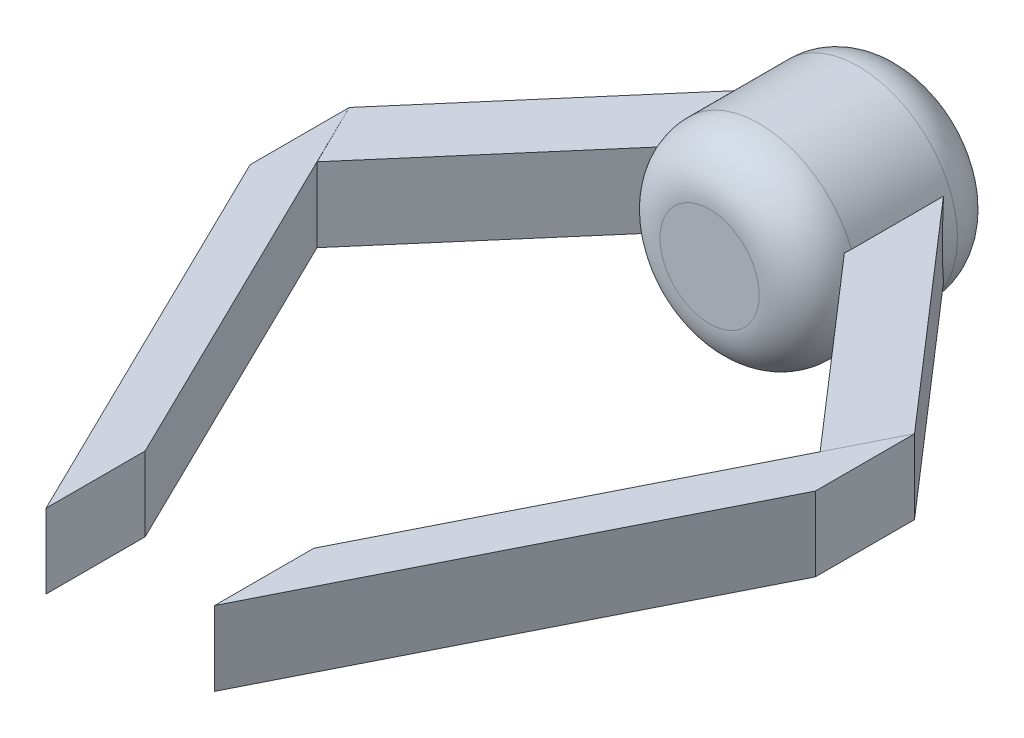
ISO-10303-21;
HEADER;
FILE_DESCRIPTION(('STEP AP214'),'2;1');
FILE_NAME('part.step','',(''),(''),'','','');
FILE_SCHEMA(('AUTOMOTIVE_DESIGN { 1 0 10303 214 1 1 1 1 }'));
ENDSEC;
DATA;
#1=APPLICATION_CONTEXT('core data for automotive mechanical design processes');
#2=APPLICATION_PROTOCOL_DEFINITION('international standard','automotive_design',2000,#1);
#3=PRODUCT_CONTEXT('',#1,'mechanical');
#4=PRODUCT('Part','Part','',(#3));
#5=PRODUCT_RELATED_PRODUCT_CATEGORY('part','',(#4));
#6=PRODUCT_DEFINITION_FORMATION('','',#4);
#7=PRODUCT_DEFINITION_CONTEXT('part definition',#1,'design');
#8=PRODUCT_DEFINITION('design','',#6,#7);
#9=PRODUCT_DEFINITION_SHAPE('','',#8);
#10=(LENGTH_UNIT() NAMED_UNIT(*) SI_UNIT(.MILLI.,.METRE.));
#11=(NAMED_UNIT(*) PLANE_ANGLE_UNIT() SI_UNIT($,.RADIAN.));
#12=(NAMED_UNIT(*) SI_UNIT($,.STERADIAN.) SOLID_ANGLE_UNIT());
#13=UNCERTAINTY_MEASURE_WITH_UNIT(LENGTH_MEASURE(1.E-05),#10,'distance_accuracy_value','');
#14=(GEOMETRIC_REPRESENTATION_CONTEXT(3) GLOBAL_UNCERTAINTY_ASSIGNED_CONTEXT((#13)) GLOBAL_UNIT_ASSIGNED_CONTEXT((#10,
#11,#12)) REPRESENTATION_CONTEXT('',''));
#15=CARTESIAN_POINT('',(0.,0.,0.));
#16=DIRECTION('',(0.,0.,1.));
#17=DIRECTION('',(1.,0.,0.));
#18=AXIS2_PLACEMENT_3D('',#15,#16,#17);
#19=CARTESIAN_POINT('',(0.,0.,40.));
#20=DIRECTION('',(0.,0.,-1.));
#21=DIRECTION('',(-1.,0.,0.));
#22=AXIS2_PLACEMENT_3D('',#19,#20,#21);
#23=CYLINDRICAL_SURFACE('',#22,20.);
#24=CARTESIAN_POINT('',(0.,0.,10.));
#25=DIRECTION('',(0.,0.,1.));
#26=DIRECTION('',(1.,0.,0.));
#27=AXIS2_PLACEMENT_3D('',#24,#25,#26);
#28=CIRCLE('',#27,20.);
#29=CARTESIAN_POINT('',(20.,0.,10.));
#30=VERTEX_POINT('',#29);
#31=EDGE_CURVE('E256',#30,#30,#28,.T.);
#32=ORIENTED_EDGE('',*,*,#31,.T.);
#33=EDGE_LOOP('',(#32));
#34=FACE_BOUND('',#33,.T.);
#35=DIRECTION('',(0.,0.,-1.));
#36=VECTOR('',#35,1.);
#37=CARTESIAN_POINT('',(-18.6133283799586,7.31737703141151,40.));
#38=LINE('',#37,#36);
#39=CARTESIAN_POINT('',(-18.6133283799586,7.31737703141151,11.440508091184));
#40=VERTEX_POINT('',#39);
#41=CARTESIAN_POINT('',(-18.6133283799586,7.31737703141151,30.));
#42=VERTEX_POINT('',#41);
#43=EDGE_CURVE('E484',#40,#42,#38,.F.);
#44=ORIENTED_EDGE('',*,*,#43,.T.);
#45=CARTESIAN_POINT('',(0.,0.,30.));
#46=DIRECTION('',(0.,0.,1.));
#47=DIRECTION('',(1.,0.,0.));
#48=AXIS2_PLACEMENT_3D('',#45,#46,#47);
#49=CIRCLE('',#48,20.);
#50=CARTESIAN_POINT('',(18.6133283799586,7.31737703141151,30.));
#51=VERTEX_POINT('',#50);
#52=EDGE_CURVE('E497',#42,#51,#49,.F.);
#53=ORIENTED_EDGE('',*,*,#52,.T.);
#54=DIRECTION('',(0.,0.,-1.));
#55=VECTOR('',#54,1.);
#56=CARTESIAN_POINT('',(18.6133283799586,7.31737703141151,40.));
#57=LINE('',#56,#55);
#58=CARTESIAN_POINT('',(18.6133283799586,7.31737703141151,11.440508091184));
#59=VERTEX_POINT('',#58);
#60=EDGE_CURVE('E455',#51,#59,#57,.T.);
#61=ORIENTED_EDGE('',*,*,#60,.T.);
#62=CARTESIAN_POINT('',(0.,0.,-10.0060589823485));
#63=DIRECTION('',(0.75523046556724,0.,-0.65545933808215));
#64=DIRECTION('',(-0.65545933808215,0.,-0.75523046556724));
#65=AXIS2_PLACEMENT_3D('',#62,#63,#64);
#66=ELLIPSE('',#65,30.5129530361399,20.);
#67=CARTESIAN_POINT('',(18.4658717578449,-7.68189951918308,11.2706062728718));
#68=VERTEX_POINT('',#67);
#69=EDGE_CURVE('E475',#59,#68,#66,.T.);
#70=ORIENTED_EDGE('',*,*,#69,.T.);
#71=DIRECTION('',(0.,0.,-1.));
#72=VECTOR('',#71,1.);
#73=CARTESIAN_POINT('',(18.4658717578449,-7.68189951918308,40.));
#74=LINE('',#73,#72);
#75=CARTESIAN_POINT('',(18.4658717578449,-7.68189951918308,30.));
#76=VERTEX_POINT('',#75);
#77=EDGE_CURVE('E478',#68,#76,#74,.F.);
#78=ORIENTED_EDGE('',*,*,#77,.T.);
#79=CARTESIAN_POINT('',(0.,0.,30.));
#80=DIRECTION('',(0.,0.,1.));
#81=DIRECTION('',(1.,0.,0.));
#82=AXIS2_PLACEMENT_3D('',#79,#80,#81);
#83=CIRCLE('',#82,20.);
#84=CARTESIAN_POINT('',(-18.4658717578449,-7.68189951918308,30.));
#85=VERTEX_POINT('',#84);
#86=EDGE_CURVE('E495',#76,#85,#83,.F.);
#87=ORIENTED_EDGE('',*,*,#86,.T.);
#88=DIRECTION('',(0.,0.,-1.));
#89=VECTOR('',#88,1.);
#90=CARTESIAN_POINT('',(-18.4658717578449,-7.68189951918308,40.));
#91=LINE('',#90,#89);
#92=CARTESIAN_POINT('',(-18.4658717578449,-7.68189951918308,11.2706062728718));
#93=VERTEX_POINT('',#92);
#94=EDGE_CURVE('E490',#85,#93,#91,.T.);
#95=ORIENTED_EDGE('',*,*,#94,.T.);
#96=CARTESIAN_POINT('',(0.,0.,-10.0060589823485));
#97=DIRECTION('',(-0.75523046556724,0.,-0.65545933808215));
#98=DIRECTION('',(0.65545933808215,0.,-0.75523046556724));
#99=AXIS2_PLACEMENT_3D('',#96,#97,#98);
#100=ELLIPSE('',#99,30.5129530361399,20.);
#101=EDGE_CURVE('E487',#93,#40,#100,.T.);
#102=ORIENTED_EDGE('',*,*,#101,.T.);
#103=EDGE_LOOP('',(#44,#53,#61,#70,#78,#87,#95,#102));
#104=FACE_BOUND('',#103,.T.);
#105=ADVANCED_FACE('F248',(#34,#104),#23,.T.);
#106=CARTESIAN_POINT('',(0.,0.,40.));
#107=DIRECTION('',(0.,0.,1.));
#108=DIRECTION('',(1.,0.,0.));
#109=AXIS2_PLACEMENT_3D('',#106,#107,#108);
#110=PLANE('',#109);
#111=CARTESIAN_POINT('',(0.,0.,40.));
#112=DIRECTION('',(0.,0.,1.));
#113=DIRECTION('',(1.,0.,0.));
#114=AXIS2_PLACEMENT_3D('',#111,#112,#113);
#115=CIRCLE('',#114,10.);
#116=CARTESIAN_POINT('',(10.,0.,40.));
#117=VERTEX_POINT('',#116);
#118=EDGE_CURVE('E492',#117,#117,#115,.T.);
#119=ORIENTED_EDGE('',*,*,#118,.T.);
#120=EDGE_LOOP('',(#119));
#121=FACE_BOUND('',#120,.T.);
#122=ADVANCED_FACE('F528',(#121),#110,.T.);
#123=CARTESIAN_POINT('',(0.,0.,0.));
#124=DIRECTION('',(0.,0.,1.));
#125=DIRECTION('',(1.,0.,0.));
#126=AXIS2_PLACEMENT_3D('',#123,#124,#125);
#127=PLANE('',#126);
#128=CARTESIAN_POINT('',(0.,0.,0.));
#129=DIRECTION('',(0.,0.,1.));
#130=DIRECTION('',(1.,0.,0.));
#131=AXIS2_PLACEMENT_3D('',#128,#129,#130);
#132=CIRCLE('',#131,10.);
#133=CARTESIAN_POINT('',(10.,0.,0.));
#134=VERTEX_POINT('',#133);
#135=EDGE_CURVE('E12',#134,#134,#132,.F.);
#136=ORIENTED_EDGE('',*,*,#135,.T.);
#137=EDGE_LOOP('',(#136));
#138=FACE_BOUND('',#137,.T.);
#139=CARTESIAN_POINT('',(0.,0.,0.));
#140=DIRECTION('',(0.,0.,-1.));
#141=DIRECTION('',(-1.,0.,0.));
#142=AXIS2_PLACEMENT_3D('',#139,#140,#141);
#143=CIRCLE('',#142,2.5);
#144=CARTESIAN_POINT('',(-2.5,0.,0.));
#145=VERTEX_POINT('',#144);
#146=EDGE_CURVE('E765',#145,#145,#143,.T.);
#147=ORIENTED_EDGE('',*,*,#146,.F.);
#148=EDGE_LOOP('',(#147));
#149=FACE_BOUND('',#148,.T.);
#150=ADVANCED_FACE('F531',(#138,#149),#127,.F.);
#151=CARTESIAN_POINT('',(17.,-7.67470768177073,29.5816059858695));
#152=DIRECTION('',(-0.00490612553201401,-0.99998796489371,0.));
#153=DIRECTION('',(0.,0.,-1.));
#154=AXIS2_PLACEMENT_3D('',#151,#152,#153);
#155=PLANE('',#154);
#156=ORIENTED_EDGE('',*,*,#77,.F.);
#157=DIRECTION('',(0.655455948925309,-0.00321578786848173,0.755226560527903));
#158=VECTOR('',#157,1.);
#159=CARTESIAN_POINT('',(37.,-7.77283137334007,32.6259177131848));
#160=LINE('',#159,#158);
#161=CARTESIAN_POINT('',(57.,-7.87095506490941,55.6702294405));
#162=VERTEX_POINT('',#161);
#163=EDGE_CURVE('E456',#68,#162,#160,.T.);
#164=ORIENTED_EDGE('',*,*,#163,.T.);
#165=DIRECTION('',(0.,0.,-1.));
#166=VECTOR('',#165,1.);
#167=CARTESIAN_POINT('',(57.,-7.87095506490941,65.6702294405001));
#168=LINE('',#167,#166);
#169=CARTESIAN_POINT('',(57.,-7.87095506490941,75.6702294405001));
#170=VERTEX_POINT('',#169);
#171=EDGE_CURVE('E467',#170,#162,#168,.T.);
#172=ORIENTED_EDGE('',*,*,#171,.F.);
#173=DIRECTION('',(0.655455948925309,-0.00321578786848173,0.755226560527904));
#174=VECTOR('',#173,1.);
#175=CARTESIAN_POINT('',(37.,-7.77283137334007,52.6259177131848));
#176=LINE('',#175,#174);
#177=CARTESIAN_POINT('',(18.389934983436,-7.68152695935154,31.1831107378195));
#178=VERTEX_POINT('',#177);
#179=EDGE_CURVE('E453',#178,#170,#176,.T.);
#180=ORIENTED_EDGE('',*,*,#179,.F.);
#181=CARTESIAN_POINT('',(18.389934983436,-7.68152695935154,31.1831107378195));
#182=CARTESIAN_POINT('',(18.4152314193464,-7.68165106833529,30.9867369398792));
#183=CARTESIAN_POINT('',(18.4342077018357,-7.6817441694798,30.7899574794751));
#184=CARTESIAN_POINT('',(18.459519959985,-7.68186835609038,30.3955872335361));
#185=CARTESIAN_POINT('',(18.465855935632,-7.68189944155638,30.1979964480004));
#186=CARTESIAN_POINT('',(18.4658717578449,-7.68189951918308,30.));
#187=B_SPLINE_CURVE_WITH_KNOTS('',3,(#181,#182,#183,#184,#185,#186),.UNSPECIFIED.,.F.,.F.,(4,2,
4),(0.,0.59307704054105,1.1861540816924),.UNSPECIFIED.);
#188=EDGE_CURVE('E562',#178,#76,#187,.T.);
#189=ORIENTED_EDGE('',*,*,#188,.T.);
#190=EDGE_LOOP('',(#156,#164,#172,#180,#189));
#191=FACE_BOUND('',#190,.T.);
#192=ADVANCED_FACE('F524',(#191),#155,.T.);
#193=CARTESIAN_POINT('',(17.,7.32529231822927,9.58160598586949));
#194=DIRECTION('',(0.00490612553201401,0.99998796489371,0.));
#195=DIRECTION('',(0.,0.,1.));
#196=AXIS2_PLACEMENT_3D('',#193,#194,#195);
#197=PLANE('',#196);
#198=DIRECTION('',(-0.442029656910383,0.00216867908595873,0.896997814513899));
#199=VECTOR('',#198,1.);
#200=CARTESIAN_POINT('',(67.4583256023795,7.07773445930361,34.4474561216703));
#201=LINE('',#200,#199);
#202=CARTESIAN_POINT('',(57.,7.12904493509059,55.6702294405));
#203=VERTEX_POINT('',#202);
#204=CARTESIAN_POINT('',(50.7136299080008,7.15988702709049,68.426975838835));
#205=VERTEX_POINT('',#204);
#206=EDGE_CURVE('E449',#203,#205,#201,.T.);
#207=ORIENTED_EDGE('',*,*,#206,.F.);
#208=DIRECTION('',(0.655455948925309,-0.00321578786848173,0.755226560527903));
#209=VECTOR('',#208,1.);
#210=CARTESIAN_POINT('',(37.,7.22716862665993,32.6259177131848));
#211=LINE('',#210,#209);
#212=EDGE_CURVE('E458',#59,#203,#211,.T.);
#213=ORIENTED_EDGE('',*,*,#212,.F.);
#214=ORIENTED_EDGE('',*,*,#60,.F.);
#215=CARTESIAN_POINT('',(18.6133283799586,7.31737703141151,30.));
#216=CARTESIAN_POINT('',(18.6133035437902,7.31737715326234,30.2228509303074));
#217=CARTESIAN_POINT('',(18.6053153144676,7.31741634498985,30.4451288824966));
#218=CARTESIAN_POINT('',(18.5734120695452,7.31757286819809,30.8885388302032));
#219=CARTESIAN_POINT('',(18.5494970539768,7.31769019967867,31.1096708257228));
#220=CARTESIAN_POINT('',(18.5176186452853,7.31784660103577,31.3302298431265));
#221=B_SPLINE_CURVE_WITH_KNOTS('',3,(#215,#216,#217,#218,#219,#220),.UNSPECIFIED.,.F.,.F.,(4,2,
4),(0.,0.667264349683143,1.33452869805596),.UNSPECIFIED.);
#222=CARTESIAN_POINT('',(18.5176186452853,7.31784660103577,31.3302298431265));
#223=VERTEX_POINT('',#222);
#224=EDGE_CURVE('E500',#51,#223,#221,.T.);
#225=ORIENTED_EDGE('',*,*,#224,.T.);
#226=DIRECTION('',(0.655455948925309,-0.00321578786848173,0.755226560527904));
#227=VECTOR('',#226,1.);
#228=CARTESIAN_POINT('',(37.,7.22716862665993,52.6259177131848));
#229=LINE('',#228,#227);
#230=EDGE_CURVE('E461',#223,#205,#229,.T.);
#231=ORIENTED_EDGE('',*,*,#230,.T.);
#232=EDGE_LOOP('',(#207,#213,#214,#225,#231));
#233=FACE_BOUND('',#232,.T.);
#234=ADVANCED_FACE('F518',(#233),#197,.T.);
#235=CARTESIAN_POINT('',(17.,7.32529231822927,29.5816059858695));
#236=DIRECTION('',(-0.75523046556724,0.,0.65545933808215));
#237=DIRECTION('',(0.,-1.,0.));
#238=AXIS2_PLACEMENT_3D('',#235,#236,#237);
#239=PLANE('',#238);
#240=DIRECTION('',(0.655428823088162,-0.00964925336304675,0.755195305715549));
#241=VECTOR('',#240,1.);
#242=CARTESIAN_POINT('',(16.9076171952777,-7.2807131561263,29.4751610783562));
#243=LINE('',#242,#241);
#244=CARTESIAN_POINT('',(50.7136299080009,-7.77840683447643,68.426975838835));
#245=VERTEX_POINT('',#244);
#246=EDGE_CURVE('E481',#245,#170,#243,.T.);
#247=ORIENTED_EDGE('',*,*,#246,.F.);
#248=DIRECTION('',(0.,-1.,0.));
#249=VECTOR('',#248,1.);
#250=CARTESIAN_POINT('',(50.7136299080008,7.32529231822927,68.426975838835));
#251=LINE('',#250,#249);
#252=EDGE_CURVE('E427',#205,#245,#251,.T.);
#253=ORIENTED_EDGE('',*,*,#252,.F.);
#254=ORIENTED_EDGE('',*,*,#230,.F.);
#255=CARTESIAN_POINT('',(18.5176186452853,7.31784660103577,31.3302298431265));
#256=CARTESIAN_POINT('',(18.6455391887822,6.94026148562558,31.47762188716));
#257=CARTESIAN_POINT('',(18.7623160236624,6.55408645499764,31.6121739764354));
#258=CARTESIAN_POINT('',(18.9738017795492,5.7682194425648,31.8558511606626));
#259=CARTESIAN_POINT('',(19.0685265921112,5.36853743377124,31.9649945661121));
#260=CARTESIAN_POINT('',(19.236249703062,4.55906377034585,32.1582477487434));
#261=CARTESIAN_POINT('',(19.3092640529607,4.14927982848899,32.242376020725));
#262=CARTESIAN_POINT('',(19.4339556460613,3.32223588441306,32.3860476177842));
#263=CARTESIAN_POINT('',(19.4856281617518,2.90497424711617,32.4455854957495));
#264=CARTESIAN_POINT('',(19.6108487348739,1.62693848370237,32.5898665918345));
#265=CARTESIAN_POINT('',(19.6508908629915,0.758046447279387,32.6360037559629));
#266=CARTESIAN_POINT('',(19.6434645888766,-0.978819474879019,32.6274470871791));
#267=CARTESIAN_POINT('',(19.5960012103429,-1.84679341046029,32.572759042651));
#268=CARTESIAN_POINT('',(19.4579582481926,-3.13774006631683,32.4137037900733));
#269=CARTESIAN_POINT('',(19.40013420275,-3.56930565992795,32.3470780236476));
#270=CARTESIAN_POINT('',(19.2614586244092,-4.42375114506534,32.187293860835));
#271=CARTESIAN_POINT('',(19.1806123398515,-4.84663299268091,32.0941415116679));
#272=CARTESIAN_POINT('',(18.995425894772,-5.6810035162675,31.8807668032636));
#273=CARTESIAN_POINT('',(18.8910509966583,-6.09247432588559,31.7605044188317));
#274=CARTESIAN_POINT('',(18.6584595608701,-6.89979782453106,31.4925089412613));
#275=CARTESIAN_POINT('',(18.5302231596578,-7.29563716587612,31.3447529610451));
#276=CARTESIAN_POINT('',(18.389934983436,-7.68152695935154,31.1831107378195));
#277=B_SPLINE_CURVE_WITH_KNOTS('',3,(#255,#256,#257,#258,#259,#260,#261,#262,#263,#264,#265,
#266,#267,#268,#269,#270,#271,#272,#273,#274,#275,#276),.UNSPECIFIED.,.F.,.F.,(4,2,2,2,2,2,2,2,
2,2,4),(0.,1.27443326144248,2.54794525334389,3.82051332658217,5.09336314025583,7.69542708855161,
10.297341656782,11.6175739287309,12.9375054701937,14.259398669273,15.5823972433063),.UNSPECIFIED.);
#278=EDGE_CURVE('E508',#223,#178,#277,.T.);
#279=ORIENTED_EDGE('',*,*,#278,.T.);
#280=ORIENTED_EDGE('',*,*,#179,.T.);
#281=EDGE_LOOP('',(#247,#253,#254,#279,#280));
#282=FACE_BOUND('',#281,.T.);
#283=ADVANCED_FACE('F523',(#282),#239,.T.);
#284=CARTESIAN_POINT('',(17.,-7.67470768177073,9.58160598586949));
#285=DIRECTION('',(0.75523046556724,0.,-0.65545933808215));
#286=DIRECTION('',(0.,1.,0.));
#287=AXIS2_PLACEMENT_3D('',#284,#285,#286);
#288=PLANE('',#287);
#289=ORIENTED_EDGE('',*,*,#69,.F.);
#290=ORIENTED_EDGE('',*,*,#212,.T.);
#291=DIRECTION('',(0.,1.,0.));
#292=VECTOR('',#291,1.);
#293=CARTESIAN_POINT('',(57.,-0.370955064909409,55.6702294405));
#294=LINE('',#293,#292);
#295=EDGE_CURVE('E470',#162,#203,#294,.T.);
#296=ORIENTED_EDGE('',*,*,#295,.F.);
#297=ORIENTED_EDGE('',*,*,#163,.F.);
#298=EDGE_LOOP('',(#289,#290,#296,#297));
#299=FACE_BOUND('',#298,.T.);
#300=ADVANCED_FACE('F526',(#299),#288,.T.);
#301=CARTESIAN_POINT('',(57.,0.,0.));
#302=DIRECTION('',(1.,0.,0.));
#303=DIRECTION('',(0.,0.,-1.));
#304=AXIS2_PLACEMENT_3D('',#301,#302,#303);
#305=PLANE('',#304);
#306=DIRECTION('',(0.,-1.,0.));
#307=VECTOR('',#306,1.);
#308=CARTESIAN_POINT('',(57.,-0.370955064909409,75.6702294405001));
#309=LINE('',#308,#307);
#310=CARTESIAN_POINT('',(57.,7.12904493509059,75.6702294405001));
#311=VERTEX_POINT('',#310);
#312=EDGE_CURVE('E464',#311,#170,#309,.T.);
#313=ORIENTED_EDGE('',*,*,#312,.T.);
#314=ORIENTED_EDGE('',*,*,#171,.T.);
#315=ORIENTED_EDGE('',*,*,#295,.T.);
#316=DIRECTION('',(0.,0.,1.));
#317=VECTOR('',#316,1.);
#318=CARTESIAN_POINT('',(57.,7.12904493509059,65.6702294405001));
#319=LINE('',#318,#317);
#320=EDGE_CURVE('E452',#203,#311,#319,.T.);
#321=ORIENTED_EDGE('',*,*,#320,.T.);
#322=EDGE_LOOP('',(#313,#314,#315,#321));
#323=FACE_BOUND('',#322,.T.);
#324=ADVANCED_FACE('F582',(#323),#305,.T.);
#325=CARTESIAN_POINT('',(57.,-7.87095506490941,55.6702294405));
#326=DIRECTION('',(-0.0147204509629309,-0.999891648291678,0.));
#327=DIRECTION('',(0.,0.,1.));
#328=AXIS2_PLACEMENT_3D('',#325,#326,#327);
#329=PLANE('',#328);
#330=DIRECTION('',(-0.442021336944506,0.0065074585093071,0.896980931051235));
#331=VECTOR('',#330,1.);
#332=CARTESIAN_POINT('',(37.,-7.57651414247384,96.2556426810309));
#333=LINE('',#332,#331);
#334=CARTESIAN_POINT('',(17.,-7.28207322003828,136.841055921562));
#335=VERTEX_POINT('',#334);
#336=EDGE_CURVE('E434',#245,#335,#333,.T.);
#337=ORIENTED_EDGE('',*,*,#336,.F.);
#338=ORIENTED_EDGE('',*,*,#246,.T.);
#339=DIRECTION('',(-0.442021336944506,0.0065074585093071,0.896980931051235));
#340=VECTOR('',#339,1.);
#341=CARTESIAN_POINT('',(37.,-7.57651414247384,116.255642681031));
#342=LINE('',#341,#340);
#343=CARTESIAN_POINT('',(17.,-7.28207322003828,156.841055921562));
#344=VERTEX_POINT('',#343);
#345=EDGE_CURVE('E424',#170,#344,#342,.T.);
#346=ORIENTED_EDGE('',*,*,#345,.T.);
#347=DIRECTION('',(0.,0.,1.));
#348=VECTOR('',#347,1.);
#349=CARTESIAN_POINT('',(17.,-7.28207322003828,146.841055921562));
#350=LINE('',#349,#348);
#351=EDGE_CURVE('E436',#335,#344,#350,.T.);
#352=ORIENTED_EDGE('',*,*,#351,.F.);
#353=EDGE_LOOP('',(#337,#338,#346,#352));
#354=FACE_BOUND('',#353,.T.);
#355=ADVANCED_FACE('F585',(#354),#329,.T.);
#356=CARTESIAN_POINT('',(57.,-7.87095506490941,75.6702294405001));
#357=DIRECTION('',(0.896999923887487,0.,0.442030696384135));
#358=DIRECTION('',(0.,1.,0.));
#359=AXIS2_PLACEMENT_3D('',#356,#357,#358);
#360=PLANE('',#359);
#361=ORIENTED_EDGE('',*,*,#312,.F.);
#362=DIRECTION('',(-0.442021336944506,0.0065074585093071,0.896980931051235));
#363=VECTOR('',#362,1.);
#364=CARTESIAN_POINT('',(37.,7.42348585752616,116.255642681031));
#365=LINE('',#364,#363);
#366=CARTESIAN_POINT('',(17.,7.71792677996172,156.841055921562));
#367=VERTEX_POINT('',#366);
#368=EDGE_CURVE('E428',#311,#367,#365,.T.);
#369=ORIENTED_EDGE('',*,*,#368,.T.);
#370=DIRECTION('',(0.,1.,0.));
#371=VECTOR('',#370,1.);
#372=CARTESIAN_POINT('',(17.,0.21792677996172,156.841055921562));
#373=LINE('',#372,#371);
#374=EDGE_CURVE('E439',#344,#367,#373,.T.);
#375=ORIENTED_EDGE('',*,*,#374,.F.);
#376=ORIENTED_EDGE('',*,*,#345,.F.);
#377=EDGE_LOOP('',(#361,#369,#375,#376));
#378=FACE_BOUND('',#377,.T.);
#379=ADVANCED_FACE('F595',(#378),#360,.T.);
#380=CARTESIAN_POINT('',(57.,7.12904493509059,75.6702294405001));
#381=DIRECTION('',(0.0147204509629309,0.999891648291678,0.));
#382=DIRECTION('',(0.,0.,-1.));
#383=AXIS2_PLACEMENT_3D('',#380,#381,#382);
#384=PLANE('',#383);
#385=ORIENTED_EDGE('',*,*,#320,.F.);
#386=DIRECTION('',(-0.442021336944506,0.0065074585093071,0.896980931051235));
#387=VECTOR('',#386,1.);
#388=CARTESIAN_POINT('',(37.,7.42348585752616,96.2556426810309));
#389=LINE('',#388,#387);
#390=CARTESIAN_POINT('',(17.,7.71792677996172,136.841055921562));
#391=VERTEX_POINT('',#390);
#392=EDGE_CURVE('E431',#203,#391,#389,.T.);
#393=ORIENTED_EDGE('',*,*,#392,.T.);
#394=DIRECTION('',(0.,0.,-1.));
#395=VECTOR('',#394,1.);
#396=CARTESIAN_POINT('',(17.,7.71792677996172,146.841055921562));
#397=LINE('',#396,#395);
#398=EDGE_CURVE('E442',#367,#391,#397,.T.);
#399=ORIENTED_EDGE('',*,*,#398,.F.);
#400=ORIENTED_EDGE('',*,*,#368,.F.);
#401=EDGE_LOOP('',(#385,#393,#399,#400));
#402=FACE_BOUND('',#401,.T.);
#403=ADVANCED_FACE('F591',(#402),#384,.T.);
#404=CARTESIAN_POINT('',(57.,7.12904493509059,55.6702294405));
#405=DIRECTION('',(-0.896999923887487,0.,-0.442030696384135));
#406=DIRECTION('',(0.,-1.,0.));
#407=AXIS2_PLACEMENT_3D('',#404,#405,#406);
#408=PLANE('',#407);
#409=ORIENTED_EDGE('',*,*,#392,.F.);
#410=ORIENTED_EDGE('',*,*,#206,.T.);
#411=ORIENTED_EDGE('',*,*,#252,.T.);
#412=ORIENTED_EDGE('',*,*,#336,.T.);
#413=DIRECTION('',(0.,-1.,0.));
#414=VECTOR('',#413,1.);
#415=CARTESIAN_POINT('',(17.,0.21792677996172,136.841055921562));
#416=LINE('',#415,#414);
#417=EDGE_CURVE('E416',#391,#335,#416,.T.);
#418=ORIENTED_EDGE('',*,*,#417,.F.);
#419=EDGE_LOOP('',(#409,#410,#411,#412,#418));
#420=FACE_BOUND('',#419,.T.);
#421=ADVANCED_FACE('F587',(#420),#408,.T.);
#422=CARTESIAN_POINT('',(17.,0.,0.));
#423=DIRECTION('',(-1.,0.,0.));
#424=DIRECTION('',(0.,0.,1.));
#425=AXIS2_PLACEMENT_3D('',#422,#423,#424);
#426=PLANE('',#425);
#427=ORIENTED_EDGE('',*,*,#351,.T.);
#428=ORIENTED_EDGE('',*,*,#374,.T.);
#429=ORIENTED_EDGE('',*,*,#398,.T.);
#430=ORIENTED_EDGE('',*,*,#417,.T.);
#431=EDGE_LOOP('',(#427,#428,#429,#430));
#432=FACE_BOUND('',#431,.T.);
#433=ADVANCED_FACE('F590',(#432),#426,.T.);
#434=CARTESIAN_POINT('',(-17.,-7.67470768177073,29.5816059858695));
#435=DIRECTION('',(0.00490612553201401,-0.99998796489371,0.));
#436=DIRECTION('',(0.,0.,-1.));
#437=AXIS2_PLACEMENT_3D('',#434,#435,#436);
#438=PLANE('',#437);
#439=ORIENTED_EDGE('',*,*,#94,.F.);
#440=CARTESIAN_POINT('',(-18.4658717578449,-7.68189951918309,30.));
#441=CARTESIAN_POINT('',(-18.465855935632,-7.68189944155639,30.1979964480004));
#442=CARTESIAN_POINT('',(-18.459519959985,-7.68186835609038,30.3955872335361));
#443=CARTESIAN_POINT('',(-18.4342077018357,-7.6817441694798,30.7899574794751));
#444=CARTESIAN_POINT('',(-18.4152314193464,-7.68165106833529,30.9867369398792));
#445=CARTESIAN_POINT('',(-18.389934983436,-7.68152695935154,31.1831107378195));
#446=B_SPLINE_CURVE_WITH_KNOTS('',3,(#440,#441,#442,#443,#444,#445),.UNSPECIFIED.,.F.,.F.,(4,2,
4),(0.,0.593077041151345,1.18615408169239),.UNSPECIFIED.);
#447=CARTESIAN_POINT('',(-18.389934983436,-7.68152695935154,31.1831107378195));
#448=VERTEX_POINT('',#447);
#449=EDGE_CURVE('E563',#85,#448,#446,.T.);
#450=ORIENTED_EDGE('',*,*,#449,.T.);
#451=DIRECTION('',(-0.655455948925309,-0.00321578786848173,0.755226560527904));
#452=VECTOR('',#451,1.);
#453=CARTESIAN_POINT('',(-37.,-7.77283137334007,52.6259177131848));
#454=LINE('',#453,#452);
#455=CARTESIAN_POINT('',(-57.,-7.87095506490941,75.6702294405001));
#456=VERTEX_POINT('',#455);
#457=EDGE_CURVE('E270',#448,#456,#454,.T.);
#458=ORIENTED_EDGE('',*,*,#457,.T.);
#459=DIRECTION('',(0.,0.,-1.));
#460=VECTOR('',#459,1.);
#461=CARTESIAN_POINT('',(-57.,-7.87095506490941,65.6702294405001));
#462=LINE('',#461,#460);
#463=CARTESIAN_POINT('',(-57.,-7.87095506490941,55.6702294405));
#464=VERTEX_POINT('',#463);
#465=EDGE_CURVE('E369',#456,#464,#462,.T.);
#466=ORIENTED_EDGE('',*,*,#465,.T.);
#467=DIRECTION('',(-0.655455948925309,-0.00321578786848173,0.755226560527903));
#468=VECTOR('',#467,1.);
#469=CARTESIAN_POINT('',(-37.,-7.77283137334007,32.6259177131848));
#470=LINE('',#469,#468);
#471=EDGE_CURVE('E417',#93,#464,#470,.T.);
#472=ORIENTED_EDGE('',*,*,#471,.F.);
#473=EDGE_LOOP('',(#439,#450,#458,#466,#472));
#474=FACE_BOUND('',#473,.T.);
#475=ADVANCED_FACE('F605',(#474),#438,.T.);
#476=CARTESIAN_POINT('',(-17.,7.32529231822927,9.58160598586949));
#477=DIRECTION('',(-0.00490612553201401,0.99998796489371,0.));
#478=DIRECTION('',(0.,0.,1.));
#479=AXIS2_PLACEMENT_3D('',#476,#477,#478);
#480=PLANE('',#479);
#481=DIRECTION('',(-0.442029656910383,-0.00216867908595873,-0.896997814513899));
#482=VECTOR('',#481,1.);
#483=CARTESIAN_POINT('',(-67.4583256023795,7.07773445930361,34.4474561216703));
#484=LINE('',#483,#482);
#485=CARTESIAN_POINT('',(-50.7136299080008,7.15988702709049,68.426975838835));
#486=VERTEX_POINT('',#485);
#487=CARTESIAN_POINT('',(-57.,7.12904493509059,55.6702294405));
#488=VERTEX_POINT('',#487);
#489=EDGE_CURVE('E410',#486,#488,#484,.T.);
#490=ORIENTED_EDGE('',*,*,#489,.F.);
#491=DIRECTION('',(-0.655455948925309,-0.00321578786848173,0.755226560527904));
#492=VECTOR('',#491,1.);
#493=CARTESIAN_POINT('',(-37.,7.22716862665993,52.6259177131848));
#494=LINE('',#493,#492);
#495=CARTESIAN_POINT('',(-18.5176186452853,7.31784660103577,31.3302298431265));
#496=VERTEX_POINT('',#495);
#497=EDGE_CURVE('E263',#496,#486,#494,.T.);
#498=ORIENTED_EDGE('',*,*,#497,.F.);
#499=CARTESIAN_POINT('',(-18.5176186452853,7.31784660103577,31.3302298431265));
#500=CARTESIAN_POINT('',(-18.5494970539768,7.31769019967867,31.1096708257228));
#501=CARTESIAN_POINT('',(-18.5734120695452,7.31757286819809,30.8885388302032));
#502=CARTESIAN_POINT('',(-18.6053153144676,7.31741634498985,30.4451288824966));
#503=CARTESIAN_POINT('',(-18.6133035437902,7.31737715326234,30.2228509303074));
#504=CARTESIAN_POINT('',(-18.6133283799586,7.31737703141151,30.));
#505=B_SPLINE_CURVE_WITH_KNOTS('',3,(#499,#500,#501,#502,#503,#504),.UNSPECIFIED.,.F.,.F.,(4,2,
4),(0.,0.667264348372822,1.33452869805596),.UNSPECIFIED.);
#506=EDGE_CURVE('E550',#496,#42,#505,.T.);
#507=ORIENTED_EDGE('',*,*,#506,.T.);
#508=ORIENTED_EDGE('',*,*,#43,.F.);
#509=DIRECTION('',(-0.655455948925309,-0.00321578786848173,0.755226560527903));
#510=VECTOR('',#509,1.);
#511=CARTESIAN_POINT('',(-37.,7.22716862665993,32.6259177131848));
#512=LINE('',#511,#510);
#513=EDGE_CURVE('E419',#40,#488,#512,.T.);
#514=ORIENTED_EDGE('',*,*,#513,.T.);
#515=EDGE_LOOP('',(#490,#498,#507,#508,#514));
#516=FACE_BOUND('',#515,.T.);
#517=ADVANCED_FACE('F607',(#516),#480,.T.);
#518=CARTESIAN_POINT('',(-17.,7.32529231822927,29.5816059858695));
#519=DIRECTION('',(0.75523046556724,0.,0.65545933808215));
#520=DIRECTION('',(0.,-1.,0.));
#521=AXIS2_PLACEMENT_3D('',#518,#519,#520);
#522=PLANE('',#521);
#523=DIRECTION('',(0.655428823088162,0.00964925336304675,-0.755195305715549));
#524=VECTOR('',#523,1.);
#525=CARTESIAN_POINT('',(-16.9076171952777,-7.2807131561263,29.4751610783562));
#526=LINE('',#525,#524);
#527=CARTESIAN_POINT('',(-50.7136299080009,-7.77840683447643,68.426975838835));
#528=VERTEX_POINT('',#527);
#529=EDGE_CURVE('E385',#456,#528,#526,.T.);
#530=ORIENTED_EDGE('',*,*,#529,.F.);
#531=ORIENTED_EDGE('',*,*,#457,.F.);
#532=CARTESIAN_POINT('',(-18.389934983436,-7.68152695935154,31.1831107378195));
#533=CARTESIAN_POINT('',(-18.5252064504501,-7.30944348297843,31.3389726305037));
#534=CARTESIAN_POINT('',(-18.6492738530348,-6.92809675885607,31.4819250255217));
#535=CARTESIAN_POINT('',(-18.8751957753106,-6.15071523929922,31.7422357856696));
#536=CARTESIAN_POINT('',(-18.977067714613,-5.75469224992852,31.8596142219471));
#537=CARTESIAN_POINT('',(-19.1588663948517,-4.95181651972096,32.0690854948989));
#538=CARTESIAN_POINT('',(-19.2388266090879,-4.54498135095949,32.161216900031));
#539=CARTESIAN_POINT('',(-19.3773153975453,-3.72291599943139,32.3207858406286));
#540=CARTESIAN_POINT('',(-19.4358390386674,-3.30768390748905,32.3882176921002));
#541=CARTESIAN_POINT('',(-19.5804450192407,-2.04644308024685,32.5548349567985));
#542=CARTESIAN_POINT('',(-19.6341263068842,-1.19134277260237,32.6166873731176));
#543=CARTESIAN_POINT('',(-19.6563582741824,0.521635577812739,32.6423033923541));
#544=CARTESIAN_POINT('',(-19.6248814431318,1.37951442878694,32.6060352970082));
#545=CARTESIAN_POINT('',(-19.5118999607372,2.67023189712137,32.4758562720225));
#546=CARTESIAN_POINT('',(-19.4615810095561,3.10983072697124,32.417877992182));
#547=CARTESIAN_POINT('',(-19.3374158088605,3.98124966437026,32.2748129126563));
#548=CARTESIAN_POINT('',(-19.2635741058824,4.41307125809636,32.1897313515611));
#549=CARTESIAN_POINT('',(-19.0919545170572,5.26600145485432,31.9919885863911));
#550=CARTESIAN_POINT('',(-18.994153722013,5.68709937616911,31.8793009859822));
#551=CARTESIAN_POINT('',(-18.7742247584164,6.51457914231399,31.6258954062329));
#552=CARTESIAN_POINT('',(-18.6520782154973,6.9209495965,31.4851562556608));
#553=CARTESIAN_POINT('',(-18.5176186452853,7.31784660103578,31.3302298431265));
#554=B_SPLINE_CURVE_WITH_KNOTS('',3,(#532,#533,#534,#535,#536,#537,#538,#539,#540,#541,#542,
#543,#544,#545,#546,#547,#548,#549,#550,#551,#552,#553),.UNSPECIFIED.,.F.,.F.,(4,2,2,2,2,2,2,2,
2,2,4),(0.,1.27573092903001,2.55045699356681,3.82322473584162,5.0962851905191,7.66262609253894,
10.2297961612791,11.5672822053903,12.9045098935388,14.2430212367598,15.5825466407184),.UNSPECIFIED.);
#555=EDGE_CURVE('E564',#448,#496,#554,.T.);
#556=ORIENTED_EDGE('',*,*,#555,.T.);
#557=ORIENTED_EDGE('',*,*,#497,.T.);
#558=DIRECTION('',(0.,1.,0.));
#559=VECTOR('',#558,1.);
#560=CARTESIAN_POINT('',(-50.7136299080008,7.32529231822927,68.426975838835));
#561=LINE('',#560,#559);
#562=EDGE_CURVE('E391',#528,#486,#561,.T.);
#563=ORIENTED_EDGE('',*,*,#562,.F.);
#564=EDGE_LOOP('',(#530,#531,#556,#557,#563));
#565=FACE_BOUND('',#564,.T.);
#566=ADVANCED_FACE('F611',(#565),#522,.T.);
#567=CARTESIAN_POINT('',(-17.,-7.67470768177073,9.58160598586949));
#568=DIRECTION('',(-0.75523046556724,0.,-0.65545933808215));
#569=DIRECTION('',(0.,1.,0.));
#570=AXIS2_PLACEMENT_3D('',#567,#568,#569);
#571=PLANE('',#570);
#572=ORIENTED_EDGE('',*,*,#101,.F.);
#573=ORIENTED_EDGE('',*,*,#471,.T.);
#574=DIRECTION('',(0.,1.,0.));
#575=VECTOR('',#574,1.);
#576=CARTESIAN_POINT('',(-57.,-0.370955064909409,55.6702294405));
#577=LINE('',#576,#575);
#578=EDGE_CURVE('E384',#464,#488,#577,.T.);
#579=ORIENTED_EDGE('',*,*,#578,.T.);
#580=ORIENTED_EDGE('',*,*,#513,.F.);
#581=EDGE_LOOP('',(#572,#573,#579,#580));
#582=FACE_BOUND('',#581,.T.);
#583=ADVANCED_FACE('F612',(#582),#571,.T.);
#584=CARTESIAN_POINT('',(-57.,0.,0.));
#585=DIRECTION('',(-1.,0.,0.));
#586=DIRECTION('',(0.,0.,-1.));
#587=AXIS2_PLACEMENT_3D('',#584,#585,#586);
#588=PLANE('',#587);
#589=DIRECTION('',(0.,-1.,0.));
#590=VECTOR('',#589,1.);
#591=CARTESIAN_POINT('',(-57.,-0.370955064909409,75.6702294405001));
#592=LINE('',#591,#590);
#593=CARTESIAN_POINT('',(-57.,7.12904493509059,75.6702294405001));
#594=VERTEX_POINT('',#593);
#595=EDGE_CURVE('E362',#594,#456,#592,.T.);
#596=ORIENTED_EDGE('',*,*,#595,.F.);
#597=DIRECTION('',(0.,0.,1.));
#598=VECTOR('',#597,1.);
#599=CARTESIAN_POINT('',(-57.,7.12904493509059,65.6702294405001));
#600=LINE('',#599,#598);
#601=EDGE_CURVE('E366',#488,#594,#600,.T.);
#602=ORIENTED_EDGE('',*,*,#601,.F.);
#603=ORIENTED_EDGE('',*,*,#578,.F.);
#604=ORIENTED_EDGE('',*,*,#465,.F.);
#605=EDGE_LOOP('',(#596,#602,#603,#604));
#606=FACE_BOUND('',#605,.T.);
#607=ADVANCED_FACE('F364',(#606),#588,.T.);
#608=CARTESIAN_POINT('',(-57.,-7.87095506490941,55.6702294405));
#609=DIRECTION('',(0.0147204509629309,-0.999891648291678,0.));
#610=DIRECTION('',(0.,0.,1.));
#611=AXIS2_PLACEMENT_3D('',#608,#609,#610);
#612=PLANE('',#611);
#613=DIRECTION('',(0.442021336944506,0.0065074585093071,0.896980931051235));
#614=VECTOR('',#613,1.);
#615=CARTESIAN_POINT('',(-37.,-7.57651414247384,116.255642681031));
#616=LINE('',#615,#614);
#617=CARTESIAN_POINT('',(-17.,-7.28207322003828,156.841055921562));
#618=VERTEX_POINT('',#617);
#619=EDGE_CURVE('E389',#456,#618,#616,.T.);
#620=ORIENTED_EDGE('',*,*,#619,.F.);
#621=ORIENTED_EDGE('',*,*,#529,.T.);
#622=DIRECTION('',(0.442021336944506,0.0065074585093071,0.896980931051235));
#623=VECTOR('',#622,1.);
#624=CARTESIAN_POINT('',(-37.,-7.57651414247384,96.2556426810309));
#625=LINE('',#624,#623);
#626=CARTESIAN_POINT('',(-17.,-7.28207322003828,136.841055921562));
#627=VERTEX_POINT('',#626);
#628=EDGE_CURVE('E393',#528,#627,#625,.T.);
#629=ORIENTED_EDGE('',*,*,#628,.T.);
#630=DIRECTION('',(0.,0.,1.));
#631=VECTOR('',#630,1.);
#632=CARTESIAN_POINT('',(-17.,-7.28207322003828,146.841055921562));
#633=LINE('',#632,#631);
#634=EDGE_CURVE('E398',#627,#618,#633,.T.);
#635=ORIENTED_EDGE('',*,*,#634,.T.);
#636=EDGE_LOOP('',(#620,#621,#629,#635));
#637=FACE_BOUND('',#636,.T.);
#638=ADVANCED_FACE('F640',(#637),#612,.T.);
#639=CARTESIAN_POINT('',(-57.,-7.87095506490941,75.6702294405001));
#640=DIRECTION('',(-0.896999923887487,0.,0.442030696384135));
#641=DIRECTION('',(0.,1.,0.));
#642=AXIS2_PLACEMENT_3D('',#639,#640,#641);
#643=PLANE('',#642);
#644=ORIENTED_EDGE('',*,*,#595,.T.);
#645=ORIENTED_EDGE('',*,*,#619,.T.);
#646=DIRECTION('',(0.,1.,0.));
#647=VECTOR('',#646,1.);
#648=CARTESIAN_POINT('',(-17.,0.21792677996172,156.841055921562));
#649=LINE('',#648,#647);
#650=CARTESIAN_POINT('',(-17.,7.71792677996172,156.841055921562));
#651=VERTEX_POINT('',#650);
#652=EDGE_CURVE('E388',#618,#651,#649,.T.);
#653=ORIENTED_EDGE('',*,*,#652,.T.);
#654=DIRECTION('',(0.442021336944506,0.0065074585093071,0.896980931051235));
#655=VECTOR('',#654,1.);
#656=CARTESIAN_POINT('',(-37.,7.42348585752616,116.255642681031));
#657=LINE('',#656,#655);
#658=EDGE_CURVE('E380',#594,#651,#657,.T.);
#659=ORIENTED_EDGE('',*,*,#658,.F.);
#660=EDGE_LOOP('',(#644,#645,#653,#659));
#661=FACE_BOUND('',#660,.T.);
#662=ADVANCED_FACE('F387',(#661),#643,.T.);
#663=CARTESIAN_POINT('',(-57.,7.12904493509059,75.6702294405001));
#664=DIRECTION('',(-0.0147204509629309,0.999891648291678,0.));
#665=DIRECTION('',(0.,0.,-1.));
#666=AXIS2_PLACEMENT_3D('',#663,#664,#665);
#667=PLANE('',#666);
#668=ORIENTED_EDGE('',*,*,#601,.T.);
#669=ORIENTED_EDGE('',*,*,#658,.T.);
#670=DIRECTION('',(0.,0.,-1.));
#671=VECTOR('',#670,1.);
#672=CARTESIAN_POINT('',(-17.,7.71792677996172,146.841055921562));
#673=LINE('',#672,#671);
#674=CARTESIAN_POINT('',(-17.,7.71792677996172,136.841055921562));
#675=VERTEX_POINT('',#674);
#676=EDGE_CURVE('E402',#651,#675,#673,.T.);
#677=ORIENTED_EDGE('',*,*,#676,.T.);
#678=DIRECTION('',(0.442021336944506,0.0065074585093071,0.896980931051235));
#679=VECTOR('',#678,1.);
#680=CARTESIAN_POINT('',(-37.,7.42348585752616,96.2556426810309));
#681=LINE('',#680,#679);
#682=EDGE_CURVE('E383',#488,#675,#681,.T.);
#683=ORIENTED_EDGE('',*,*,#682,.F.);
#684=EDGE_LOOP('',(#668,#669,#677,#683));
#685=FACE_BOUND('',#684,.T.);
#686=ADVANCED_FACE('F378',(#685),#667,.T.);
#687=CARTESIAN_POINT('',(-57.,7.12904493509059,55.6702294405));
#688=DIRECTION('',(0.896999923887487,0.,-0.442030696384135));
#689=DIRECTION('',(0.,-1.,0.));
#690=AXIS2_PLACEMENT_3D('',#687,#688,#689);
#691=PLANE('',#690);
#692=ORIENTED_EDGE('',*,*,#562,.T.);
#693=ORIENTED_EDGE('',*,*,#489,.T.);
#694=ORIENTED_EDGE('',*,*,#682,.T.);
#695=DIRECTION('',(0.,-1.,0.));
#696=VECTOR('',#695,1.);
#697=CARTESIAN_POINT('',(-17.,0.21792677996172,136.841055921562));
#698=LINE('',#697,#696);
#699=EDGE_CURVE('E404',#675,#627,#698,.T.);
#700=ORIENTED_EDGE('',*,*,#699,.T.);
#701=ORIENTED_EDGE('',*,*,#628,.F.);
#702=EDGE_LOOP('',(#692,#693,#694,#700,#701));
#703=FACE_BOUND('',#702,.T.);
#704=ADVANCED_FACE('F637',(#703),#691,.T.);
#705=CARTESIAN_POINT('',(-17.,0.,0.));
#706=DIRECTION('',(1.,0.,0.));
#707=DIRECTION('',(0.,0.,1.));
#708=AXIS2_PLACEMENT_3D('',#705,#706,#707);
#709=PLANE('',#708);
#710=ORIENTED_EDGE('',*,*,#634,.F.);
#711=ORIENTED_EDGE('',*,*,#699,.F.);
#712=ORIENTED_EDGE('',*,*,#676,.F.);
#713=ORIENTED_EDGE('',*,*,#652,.F.);
#714=EDGE_LOOP('',(#710,#711,#712,#713));
#715=FACE_BOUND('',#714,.T.);
#716=ADVANCED_FACE('F642',(#715),#709,.T.);
#717=CARTESIAN_POINT('',(0.,0.,10.));
#718=DIRECTION('',(0.,0.,-1.));
#719=DIRECTION('',(-1.,0.,0.));
#720=AXIS2_PLACEMENT_3D('',#717,#718,#719);
#721=CYLINDRICAL_SURFACE('',#720,2.5);
#722=CARTESIAN_POINT('',(0.,0.,10.));
#723=DIRECTION('',(0.,0.,-1.));
#724=DIRECTION('',(-1.,0.,0.));
#725=AXIS2_PLACEMENT_3D('',#722,#723,#724);
#726=CIRCLE('',#725,2.5);
#727=CARTESIAN_POINT('',(-2.5,0.,10.));
#728=VERTEX_POINT('',#727);
#729=EDGE_CURVE('E407',#728,#728,#726,.T.);
#730=ORIENTED_EDGE('',*,*,#729,.F.);
#731=EDGE_LOOP('',(#730));
#732=FACE_BOUND('',#731,.T.);
#733=ORIENTED_EDGE('',*,*,#146,.T.);
#734=EDGE_LOOP('',(#733));
#735=FACE_BOUND('',#734,.T.);
#736=ADVANCED_FACE('F644',(#732,#735),#721,.F.);
#737=CARTESIAN_POINT('',(0.,0.,10.));
#738=DIRECTION('',(0.,0.,-1.));
#739=DIRECTION('',(-1.,0.,0.));
#740=AXIS2_PLACEMENT_3D('',#737,#738,#739);
#741=PLANE('',#740);
#742=ORIENTED_EDGE('',*,*,#729,.T.);
#743=EDGE_LOOP('',(#742));
#744=FACE_BOUND('',#743,.T.);
#745=ADVANCED_FACE('F650',(#744),#741,.T.);
#746=CARTESIAN_POINT('',(0.,0.,30.));
#747=DIRECTION('',(0.,0.,1.));
#748=DIRECTION('',(1.,0.,0.));
#749=AXIS2_PLACEMENT_3D('',#746,#747,#748);
#750=DEGENERATE_TOROIDAL_SURFACE('',#749,10.,10.,.T.);
#751=ORIENTED_EDGE('',*,*,#224,.F.);
#752=ORIENTED_EDGE('',*,*,#52,.F.);
#753=ORIENTED_EDGE('',*,*,#506,.F.);
#754=ORIENTED_EDGE('',*,*,#555,.F.);
#755=ORIENTED_EDGE('',*,*,#449,.F.);
#756=ORIENTED_EDGE('',*,*,#86,.F.);
#757=ORIENTED_EDGE('',*,*,#188,.F.);
#758=ORIENTED_EDGE('',*,*,#278,.F.);
#759=EDGE_LOOP('',(#751,#752,#753,#754,#755,#756,#757,#758));
#760=FACE_BOUND('',#759,.T.);
#761=ORIENTED_EDGE('',*,*,#118,.F.);
#762=EDGE_LOOP('',(#761));
#763=FACE_BOUND('',#762,.T.);
#764=ADVANCED_FACE('F515',(#760,#763),#750,.T.);
#765=CARTESIAN_POINT('',(0.,0.,10.));
#766=DIRECTION('',(0.,0.,1.));
#767=DIRECTION('',(1.,0.,0.));
#768=AXIS2_PLACEMENT_3D('',#765,#766,#767);
#769=DEGENERATE_TOROIDAL_SURFACE('',#768,10.,10.,.T.);
#770=ORIENTED_EDGE('',*,*,#135,.F.);
#771=EDGE_LOOP('',(#770));
#772=FACE_BOUND('',#771,.T.);
#773=ORIENTED_EDGE('',*,*,#31,.F.);
#774=EDGE_LOOP('',(#773));
#775=FACE_BOUND('',#774,.T.);
#776=ADVANCED_FACE('F250',(#772,#775),#769,.T.);
#777=CLOSED_SHELL('',(#105,#122,#150,#192,#234,#283,#300,#324,#355,#379,#403,#421,#433,#475,
#517,#566,#583,#607,#638,#662,#686,#704,#716,#736,#745,#764,#776));
#778=MANIFOLD_SOLID_BREP('B2',#777);
#779=ADVANCED_BREP_SHAPE_REPRESENTATION('',(#18,#778),#14);
#780=SHAPE_DEFINITION_REPRESENTATION(#9,#779);
ENDSEC;
END-ISO-10303-21;
